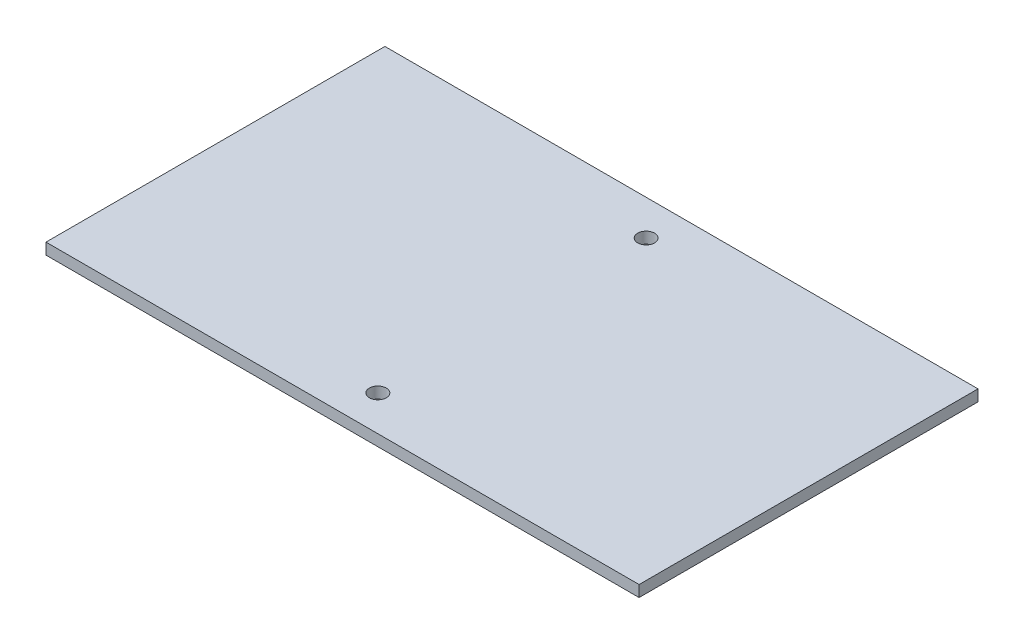
ISO-10303-21;
HEADER;
FILE_DESCRIPTION(('STEP AP214'),'2;1');
FILE_NAME('part.step','',(''),(''),'','','');
FILE_SCHEMA(('AUTOMOTIVE_DESIGN { 1 0 10303 214 1 1 1 1 }'));
ENDSEC;
DATA;
#1=APPLICATION_CONTEXT('core data for automotive mechanical design processes');
#2=APPLICATION_PROTOCOL_DEFINITION('international standard','automotive_design',2000,#1);
#3=PRODUCT_CONTEXT('',#1,'mechanical');
#4=PRODUCT('Part','Part','',(#3));
#5=PRODUCT_RELATED_PRODUCT_CATEGORY('part','',(#4));
#6=PRODUCT_DEFINITION_FORMATION('','',#4);
#7=PRODUCT_DEFINITION_CONTEXT('part definition',#1,'design');
#8=PRODUCT_DEFINITION('design','',#6,#7);
#9=PRODUCT_DEFINITION_SHAPE('','',#8);
#10=(LENGTH_UNIT() NAMED_UNIT(*) SI_UNIT(.MILLI.,.METRE.));
#11=(NAMED_UNIT(*) PLANE_ANGLE_UNIT() SI_UNIT($,.RADIAN.));
#12=(NAMED_UNIT(*) SI_UNIT($,.STERADIAN.) SOLID_ANGLE_UNIT());
#13=UNCERTAINTY_MEASURE_WITH_UNIT(LENGTH_MEASURE(1.E-05),#10,'distance_accuracy_value','');
#14=(GEOMETRIC_REPRESENTATION_CONTEXT(3) GLOBAL_UNCERTAINTY_ASSIGNED_CONTEXT((#13)) GLOBAL_UNIT_ASSIGNED_CONTEXT((#10,
#11,#12)) REPRESENTATION_CONTEXT('',''));
#15=CARTESIAN_POINT('',(0.,0.,0.));
#16=DIRECTION('',(0.,0.,1.));
#17=DIRECTION('',(1.,0.,0.));
#18=AXIS2_PLACEMENT_3D('',#15,#16,#17);
#19=CARTESIAN_POINT('',(105.,4.,-60.));
#20=DIRECTION('',(-1.,0.,0.));
#21=DIRECTION('',(0.,0.,1.));
#22=AXIS2_PLACEMENT_3D('',#19,#20,#21);
#23=PLANE('',#22);
#24=DIRECTION('',(0.,0.,-1.));
#25=VECTOR('',#24,1.);
#26=CARTESIAN_POINT('',(105.,0.,-60.));
#27=LINE('',#26,#25);
#28=CARTESIAN_POINT('',(105.,0.,60.));
#29=VERTEX_POINT('',#28);
#30=CARTESIAN_POINT('',(105.,0.,-60.));
#31=VERTEX_POINT('',#30);
#32=EDGE_CURVE('E116',#29,#31,#27,.T.);
#33=ORIENTED_EDGE('',*,*,#32,.T.);
#34=DIRECTION('',(0.,-1.,0.));
#35=VECTOR('',#34,1.);
#36=CARTESIAN_POINT('',(105.,4.,-60.));
#37=LINE('',#36,#35);
#38=CARTESIAN_POINT('',(105.,4.,-60.));
#39=VERTEX_POINT('',#38);
#40=EDGE_CURVE('E11',#39,#31,#37,.T.);
#41=ORIENTED_EDGE('',*,*,#40,.F.);
#42=DIRECTION('',(0.,0.,-1.));
#43=VECTOR('',#42,1.);
#44=CARTESIAN_POINT('',(105.,4.,-60.));
#45=LINE('',#44,#43);
#46=CARTESIAN_POINT('',(105.,4.,60.));
#47=VERTEX_POINT('',#46);
#48=EDGE_CURVE('E98',#47,#39,#45,.T.);
#49=ORIENTED_EDGE('',*,*,#48,.F.);
#50=DIRECTION('',(0.,-1.,0.));
#51=VECTOR('',#50,1.);
#52=CARTESIAN_POINT('',(105.,4.,60.));
#53=LINE('',#52,#51);
#54=EDGE_CURVE('E112',#47,#29,#53,.T.);
#55=ORIENTED_EDGE('',*,*,#54,.T.);
#56=EDGE_LOOP('',(#33,#41,#49,#55));
#57=FACE_BOUND('',#56,.T.);
#58=ADVANCED_FACE('F44',(#57),#23,.F.);
#59=CARTESIAN_POINT('',(-105.,4.,-60.));
#60=DIRECTION('',(0.,0.,1.));
#61=DIRECTION('',(1.,0.,0.));
#62=AXIS2_PLACEMENT_3D('',#59,#60,#61);
#63=PLANE('',#62);
#64=DIRECTION('',(-1.,0.,0.));
#65=VECTOR('',#64,1.);
#66=CARTESIAN_POINT('',(-105.,0.,-60.));
#67=LINE('',#66,#65);
#68=CARTESIAN_POINT('',(-105.,0.,-60.));
#69=VERTEX_POINT('',#68);
#70=EDGE_CURVE('E103',#31,#69,#67,.T.);
#71=ORIENTED_EDGE('',*,*,#70,.T.);
#72=DIRECTION('',(0.,-1.,0.));
#73=VECTOR('',#72,1.);
#74=CARTESIAN_POINT('',(-105.,4.,-60.));
#75=LINE('',#74,#73);
#76=CARTESIAN_POINT('',(-105.,4.,-60.));
#77=VERTEX_POINT('',#76);
#78=EDGE_CURVE('E54',#77,#69,#75,.T.);
#79=ORIENTED_EDGE('',*,*,#78,.F.);
#80=DIRECTION('',(-1.,0.,0.));
#81=VECTOR('',#80,1.);
#82=CARTESIAN_POINT('',(-105.,4.,-60.));
#83=LINE('',#82,#81);
#84=EDGE_CURVE('E93',#39,#77,#83,.T.);
#85=ORIENTED_EDGE('',*,*,#84,.F.);
#86=ORIENTED_EDGE('',*,*,#40,.T.);
#87=EDGE_LOOP('',(#71,#79,#85,#86));
#88=FACE_BOUND('',#87,.T.);
#89=ADVANCED_FACE('F102',(#88),#63,.F.);
#90=CARTESIAN_POINT('',(-105.,4.,-60.));
#91=DIRECTION('',(1.,0.,0.));
#92=DIRECTION('',(0.,0.,-1.));
#93=AXIS2_PLACEMENT_3D('',#90,#91,#92);
#94=PLANE('',#93);
#95=DIRECTION('',(0.,0.,1.));
#96=VECTOR('',#95,1.);
#97=CARTESIAN_POINT('',(-105.,0.,-60.));
#98=LINE('',#97,#96);
#99=CARTESIAN_POINT('',(-105.,0.,60.));
#100=VERTEX_POINT('',#99);
#101=EDGE_CURVE('E80',#69,#100,#98,.T.);
#102=ORIENTED_EDGE('',*,*,#101,.T.);
#103=DIRECTION('',(0.,-1.,0.));
#104=VECTOR('',#103,1.);
#105=CARTESIAN_POINT('',(-105.,4.,60.));
#106=LINE('',#105,#104);
#107=CARTESIAN_POINT('',(-105.,4.,60.));
#108=VERTEX_POINT('',#107);
#109=EDGE_CURVE('E105',#108,#100,#106,.T.);
#110=ORIENTED_EDGE('',*,*,#109,.F.);
#111=DIRECTION('',(0.,0.,1.));
#112=VECTOR('',#111,1.);
#113=CARTESIAN_POINT('',(-105.,4.,-60.));
#114=LINE('',#113,#112);
#115=EDGE_CURVE('E96',#77,#108,#114,.T.);
#116=ORIENTED_EDGE('',*,*,#115,.F.);
#117=ORIENTED_EDGE('',*,*,#78,.T.);
#118=EDGE_LOOP('',(#102,#110,#116,#117));
#119=FACE_BOUND('',#118,.T.);
#120=ADVANCED_FACE('F107',(#119),#94,.F.);
#121=CARTESIAN_POINT('',(-105.,4.,60.));
#122=DIRECTION('',(0.,0.,-1.));
#123=DIRECTION('',(-1.,0.,0.));
#124=AXIS2_PLACEMENT_3D('',#121,#122,#123);
#125=PLANE('',#124);
#126=DIRECTION('',(1.,0.,0.));
#127=VECTOR('',#126,1.);
#128=CARTESIAN_POINT('',(-105.,0.,60.));
#129=LINE('',#128,#127);
#130=EDGE_CURVE('E86',#100,#29,#129,.T.);
#131=ORIENTED_EDGE('',*,*,#130,.T.);
#132=ORIENTED_EDGE('',*,*,#54,.F.);
#133=DIRECTION('',(1.,0.,0.));
#134=VECTOR('',#133,1.);
#135=CARTESIAN_POINT('',(-105.,4.,60.));
#136=LINE('',#135,#134);
#137=EDGE_CURVE('E63',#108,#47,#136,.T.);
#138=ORIENTED_EDGE('',*,*,#137,.F.);
#139=ORIENTED_EDGE('',*,*,#109,.T.);
#140=EDGE_LOOP('',(#131,#132,#138,#139));
#141=FACE_BOUND('',#140,.T.);
#142=ADVANCED_FACE('F153',(#141),#125,.F.);
#143=CARTESIAN_POINT('',(0.,4.,0.));
#144=DIRECTION('',(0.,1.,0.));
#145=DIRECTION('',(0.,0.,1.));
#146=AXIS2_PLACEMENT_3D('',#143,#144,#145);
#147=PLANE('',#146);
#148=CARTESIAN_POINT('',(0.,4.,-47.5));
#149=DIRECTION('',(0.,1.,0.));
#150=DIRECTION('',(0.,0.,1.));
#151=AXIS2_PLACEMENT_3D('',#148,#149,#150);
#152=CIRCLE('',#151,3.);
#153=CARTESIAN_POINT('',(0.,4.,-44.5));
#154=VERTEX_POINT('',#153);
#155=EDGE_CURVE('E132',#154,#154,#152,.T.);
#156=ORIENTED_EDGE('',*,*,#155,.F.);
#157=EDGE_LOOP('',(#156));
#158=FACE_BOUND('',#157,.T.);
#159=CARTESIAN_POINT('',(0.,4.,47.5));
#160=DIRECTION('',(0.,1.,0.));
#161=DIRECTION('',(0.,0.,1.));
#162=AXIS2_PLACEMENT_3D('',#159,#160,#161);
#163=CIRCLE('',#162,3.);
#164=CARTESIAN_POINT('',(0.,4.,50.5));
#165=VERTEX_POINT('',#164);
#166=EDGE_CURVE('E139',#165,#165,#163,.T.);
#167=ORIENTED_EDGE('',*,*,#166,.F.);
#168=EDGE_LOOP('',(#167));
#169=FACE_BOUND('',#168,.T.);
#170=ORIENTED_EDGE('',*,*,#48,.T.);
#171=ORIENTED_EDGE('',*,*,#84,.T.);
#172=ORIENTED_EDGE('',*,*,#115,.T.);
#173=ORIENTED_EDGE('',*,*,#137,.T.);
#174=EDGE_LOOP('',(#170,#171,#172,#173));
#175=FACE_BOUND('',#174,.T.);
#176=ADVANCED_FACE('F94',(#158,#169,#175),#147,.T.);
#177=CARTESIAN_POINT('',(0.,0.,0.));
#178=DIRECTION('',(0.,1.,0.));
#179=DIRECTION('',(0.,0.,1.));
#180=AXIS2_PLACEMENT_3D('',#177,#178,#179);
#181=PLANE('',#180);
#182=CARTESIAN_POINT('',(0.,0.,-47.5));
#183=DIRECTION('',(0.,1.,0.));
#184=DIRECTION('',(0.,0.,1.));
#185=AXIS2_PLACEMENT_3D('',#182,#183,#184);
#186=CIRCLE('',#185,3.);
#187=CARTESIAN_POINT('',(0.,0.,-44.5));
#188=VERTEX_POINT('',#187);
#189=EDGE_CURVE('E47',#188,#188,#186,.T.);
#190=ORIENTED_EDGE('',*,*,#189,.T.);
#191=EDGE_LOOP('',(#190));
#192=FACE_BOUND('',#191,.T.);
#193=CARTESIAN_POINT('',(0.,0.,47.5));
#194=DIRECTION('',(0.,1.,0.));
#195=DIRECTION('',(0.,0.,1.));
#196=AXIS2_PLACEMENT_3D('',#193,#194,#195);
#197=CIRCLE('',#196,3.);
#198=CARTESIAN_POINT('',(0.,0.,50.5));
#199=VERTEX_POINT('',#198);
#200=EDGE_CURVE('E129',#199,#199,#197,.T.);
#201=ORIENTED_EDGE('',*,*,#200,.T.);
#202=EDGE_LOOP('',(#201));
#203=FACE_BOUND('',#202,.T.);
#204=ORIENTED_EDGE('',*,*,#32,.F.);
#205=ORIENTED_EDGE('',*,*,#130,.F.);
#206=ORIENTED_EDGE('',*,*,#101,.F.);
#207=ORIENTED_EDGE('',*,*,#70,.F.);
#208=EDGE_LOOP('',(#204,#205,#206,#207));
#209=FACE_BOUND('',#208,.T.);
#210=ADVANCED_FACE('F152',(#192,#203,#209),#181,.F.);
#211=CARTESIAN_POINT('',(0.,-6.,47.5));
#212=DIRECTION('',(0.,1.,0.));
#213=DIRECTION('',(0.,0.,1.));
#214=AXIS2_PLACEMENT_3D('',#211,#212,#213);
#215=CYLINDRICAL_SURFACE('',#214,3.);
#216=ORIENTED_EDGE('',*,*,#166,.T.);
#217=EDGE_LOOP('',(#216));
#218=FACE_BOUND('',#217,.T.);
#219=ORIENTED_EDGE('',*,*,#200,.F.);
#220=EDGE_LOOP('',(#219));
#221=FACE_BOUND('',#220,.T.);
#222=ADVANCED_FACE('F148',(#218,#221),#215,.F.);
#223=CARTESIAN_POINT('',(0.,-6.,-47.5));
#224=DIRECTION('',(0.,1.,0.));
#225=DIRECTION('',(0.,0.,1.));
#226=AXIS2_PLACEMENT_3D('',#223,#224,#225);
#227=CYLINDRICAL_SURFACE('',#226,3.);
#228=ORIENTED_EDGE('',*,*,#155,.T.);
#229=EDGE_LOOP('',(#228));
#230=FACE_BOUND('',#229,.T.);
#231=ORIENTED_EDGE('',*,*,#189,.F.);
#232=EDGE_LOOP('',(#231));
#233=FACE_BOUND('',#232,.T.);
#234=ADVANCED_FACE('F195',(#230,#233),#227,.F.);
#235=CLOSED_SHELL('',(#58,#89,#120,#142,#176,#210,#222,#234));
#236=MANIFOLD_SOLID_BREP('B2',#235);
#237=ADVANCED_BREP_SHAPE_REPRESENTATION('',(#18,#236),#14);
#238=SHAPE_DEFINITION_REPRESENTATION(#9,#237);
ENDSEC;
END-ISO-10303-21;
